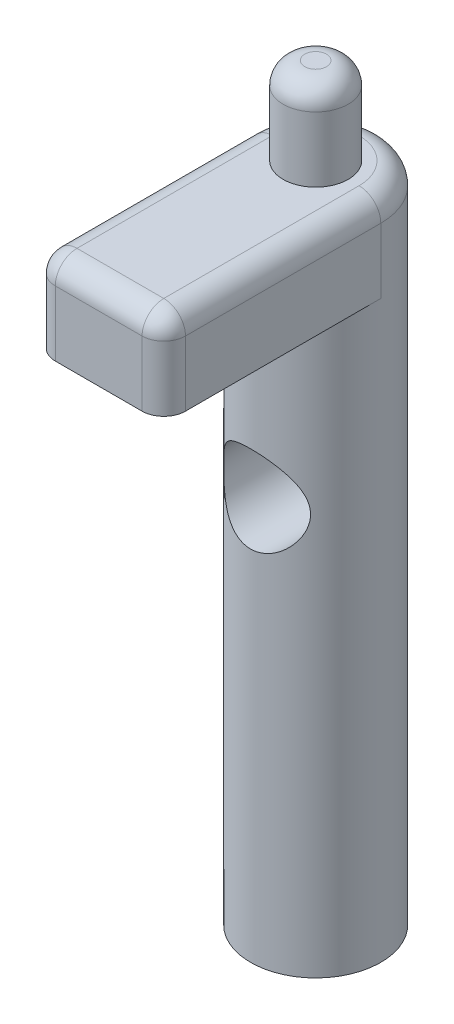
ISO-10303-21;
HEADER;
FILE_DESCRIPTION(('STEP AP214'),'2;1');
FILE_NAME('part.step','',(''),(''),'','','');
FILE_SCHEMA(('AUTOMOTIVE_DESIGN { 1 0 10303 214 1 1 1 1 }'));
ENDSEC;
DATA;
#1=APPLICATION_CONTEXT('core data for automotive mechanical design processes');
#2=APPLICATION_PROTOCOL_DEFINITION('international standard','automotive_design',2000,#1);
#3=PRODUCT_CONTEXT('',#1,'mechanical');
#4=PRODUCT('Part','Part','',(#3));
#5=PRODUCT_RELATED_PRODUCT_CATEGORY('part','',(#4));
#6=PRODUCT_DEFINITION_FORMATION('','',#4);
#7=PRODUCT_DEFINITION_CONTEXT('part definition',#1,'design');
#8=PRODUCT_DEFINITION('design','',#6,#7);
#9=PRODUCT_DEFINITION_SHAPE('','',#8);
#10=(LENGTH_UNIT() NAMED_UNIT(*) SI_UNIT(.MILLI.,.METRE.));
#11=(NAMED_UNIT(*) PLANE_ANGLE_UNIT() SI_UNIT($,.RADIAN.));
#12=(NAMED_UNIT(*) SI_UNIT($,.STERADIAN.) SOLID_ANGLE_UNIT());
#13=UNCERTAINTY_MEASURE_WITH_UNIT(LENGTH_MEASURE(1.E-05),#10,'distance_accuracy_value','');
#14=(GEOMETRIC_REPRESENTATION_CONTEXT(3) GLOBAL_UNCERTAINTY_ASSIGNED_CONTEXT((#13)) GLOBAL_UNIT_ASSIGNED_CONTEXT((#10,
#11,#12)) REPRESENTATION_CONTEXT('',''));
#15=CARTESIAN_POINT('',(0.,0.,0.));
#16=DIRECTION('',(0.,0.,1.));
#17=DIRECTION('',(1.,0.,0.));
#18=AXIS2_PLACEMENT_3D('',#15,#16,#17);
#19=CARTESIAN_POINT('',(0.,25.,0.));
#20=DIRECTION('',(0.,-1.,0.));
#21=DIRECTION('',(0.,0.,-1.));
#22=AXIS2_PLACEMENT_3D('',#19,#20,#21);
#23=CYLINDRICAL_SURFACE('',#22,3.);
#24=DIRECTION('',(0.,-1.,0.));
#25=VECTOR('',#24,1.);
#26=CARTESIAN_POINT('',(-3.,29.,0.));
#27=LINE('',#26,#25);
#28=CARTESIAN_POINT('',(-3.,28.,0.));
#29=VERTEX_POINT('',#28);
#30=CARTESIAN_POINT('',(-3.,25.,0.));
#31=VERTEX_POINT('',#30);
#32=EDGE_CURVE('E117',#29,#31,#27,.T.);
#33=ORIENTED_EDGE('',*,*,#32,.F.);
#34=CARTESIAN_POINT('',(0.,28.,0.));
#35=DIRECTION('',(0.,1.,0.));
#36=DIRECTION('',(0.,0.,1.));
#37=AXIS2_PLACEMENT_3D('',#34,#35,#36);
#38=CIRCLE('',#37,3.);
#39=CARTESIAN_POINT('',(3.,28.,0.));
#40=VERTEX_POINT('',#39);
#41=EDGE_CURVE('E115',#29,#40,#38,.F.);
#42=ORIENTED_EDGE('',*,*,#41,.T.);
#43=DIRECTION('',(0.,-1.,0.));
#44=VECTOR('',#43,1.);
#45=CARTESIAN_POINT('',(3.,29.,0.));
#46=LINE('',#45,#44);
#47=CARTESIAN_POINT('',(3.,25.,0.));
#48=VERTEX_POINT('',#47);
#49=EDGE_CURVE('E100',#40,#48,#46,.T.);
#50=ORIENTED_EDGE('',*,*,#49,.T.);
#51=CARTESIAN_POINT('',(0.,25.,0.));
#52=DIRECTION('',(0.,-1.,0.));
#53=DIRECTION('',(0.,0.,1.));
#54=AXIS2_PLACEMENT_3D('',#51,#52,#53);
#55=CIRCLE('',#54,3.);
#56=EDGE_CURVE('E106',#48,#31,#55,.T.);
#57=ORIENTED_EDGE('',*,*,#56,.T.);
#58=EDGE_LOOP('',(#33,#42,#50,#57));
#59=FACE_BOUND('',#58,.T.);
#60=CARTESIAN_POINT('',(-2.,17.,2.23606797749979));
#61=CARTESIAN_POINT('',(-1.99999453997731,16.9023716891314,2.23607753462817));
#62=CARTESIAN_POINT('',(-1.99278992503664,16.8047092462912,2.24258071047442));
#63=CARTESIAN_POINT('',(-1.96458268317731,16.6128800883492,2.26731972501617));
#64=CARTESIAN_POINT('',(-1.94355530587862,16.5187199644704,2.2855766081271));
#65=CARTESIAN_POINT('',(-1.88935861676632,16.3372645581223,2.3305658582557));
#66=CARTESIAN_POINT('',(-1.85630718014214,16.2499123032623,2.35721561794602));
#67=CARTESIAN_POINT('',(-1.77934008393538,16.0821341676533,2.41584094681826));
#68=CARTESIAN_POINT('',(-1.73542216812163,16.0017097300235,2.44781762158831));
#69=CARTESIAN_POINT('',(-1.63002410007714,15.8363531123831,2.51946072932026));
#70=CARTESIAN_POINT('',(-1.56687435451732,15.7526678822828,2.55954936090364));
#71=CARTESIAN_POINT('',(-1.4281921974068,15.5959972911257,2.63944827308083));
#72=CARTESIAN_POINT('',(-1.3526477317708,15.5230224783415,2.67925824297985));
#73=CARTESIAN_POINT('',(-1.17815690494295,15.3793563412183,2.76088818523747));
#74=CARTESIAN_POINT('',(-1.07740643965819,15.3105174882243,2.80216785846923));
#75=CARTESIAN_POINT('',(-0.862470964212231,15.1913579045099,2.87558484482764));
#76=CARTESIAN_POINT('',(-0.748301152321703,15.1410164859688,2.90773236231037));
#77=CARTESIAN_POINT('',(-0.523249073480002,15.0664435989825,2.95599907464725));
#78=CARTESIAN_POINT('',(-0.413434725181415,15.0399166555044,2.97351175615867));
#79=CARTESIAN_POINT('',(-0.189695448729861,15.0058155107164,2.99609745461921));
#80=CARTESIAN_POINT('',(-0.0757758812858245,14.9982174407746,3.00118613762359));
#81=CARTESIAN_POINT('',(0.13414705023233,15.0021724499491,2.99855361722953));
#82=CARTESIAN_POINT('',(0.230240638008753,15.0109890513171,2.99266264910127));
#83=CARTESIAN_POINT('',(0.419238633271016,15.0420910513589,2.9720818279002));
#84=CARTESIAN_POINT('',(0.512142807649724,15.0643774323035,2.95739133313102));
#85=CARTESIAN_POINT('',(0.692077937671169,15.1211956847946,2.92052091703736));
#86=CARTESIAN_POINT('',(0.779130623845962,15.1556788851986,2.89837077982679));
#87=CARTESIAN_POINT('',(0.946209150653556,15.2355536429528,2.84821104476287));
#88=CARTESIAN_POINT('',(1.0262337049694,15.2809471915015,2.82020037745161));
#89=CARTESIAN_POINT('',(1.18828429196344,15.3879787374599,2.75618058450702));
#90=CARTESIAN_POINT('',(1.26919148099708,15.4509675233528,2.71960408792025));
#91=CARTESIAN_POINT('',(1.41998807498305,15.5878986794803,2.64400601826998));
#92=CARTESIAN_POINT('',(1.48986013519457,15.6618579459338,2.60498072815232));
#93=CARTESIAN_POINT('',(1.62772235326165,15.8319632102133,2.52150044944152));
#94=CARTESIAN_POINT('',(1.69373593126354,15.9297710797145,2.47714320008932));
#95=CARTESIAN_POINT('',(1.80834874945483,16.1375098392207,2.39475610831095));
#96=CARTESIAN_POINT('',(1.85697718654898,16.2474199944139,2.35671571534889));
#97=CARTESIAN_POINT('',(1.92332724567776,16.4447190620731,2.30262870306889));
#98=CARTESIAN_POINT('',(1.94590791747533,16.5295933700569,2.28340364577668));
#99=CARTESIAN_POINT('',(1.97979555580014,16.7030394898168,2.25409039789612));
#100=CARTESIAN_POINT('',(1.99112206964395,16.7916046111726,2.24398636782354));
#101=CARTESIAN_POINT('',(2.00179400148877,16.9704429864415,2.23447556987372));
#102=CARTESIAN_POINT('',(2.00108729753098,17.0607219785201,2.2351153386647));
#103=CARTESIAN_POINT('',(1.98761629716365,17.239683833955,2.24709880368953));
#104=CARTESIAN_POINT('',(1.97484222690381,17.3283653441074,2.2584511764885));
#105=CARTESIAN_POINT('',(1.93899811187046,17.4973894175498,2.28927977500746));
#106=CARTESIAN_POINT('',(1.91646174529973,17.5779277090026,2.30833187069749));
#107=CARTESIAN_POINT('',(1.86223041628513,17.7341262360503,2.3522995853365));
#108=CARTESIAN_POINT('',(1.83053237805352,17.809784822963,2.3772171729463));
#109=CARTESIAN_POINT('',(1.75163346599563,17.9702020038475,2.43611483596194));
#110=CARTESIAN_POINT('',(1.70260028818246,18.0537568115427,2.47091081434316));
#111=CARTESIAN_POINT('',(1.59352731501439,18.2124168026173,2.54262514806633));
#112=CARTESIAN_POINT('',(1.53347411883828,18.2875115167425,2.57954604947543));
#113=CARTESIAN_POINT('',(1.38876657712435,18.4439623474675,2.66075678321007));
#114=CARTESIAN_POINT('',(1.30160386514207,18.5231028482483,2.70489452138573));
#115=CARTESIAN_POINT('',(1.1130994886622,18.6658166829403,2.78775581841638));
#116=CARTESIAN_POINT('',(1.01177047745701,18.7294037712567,2.82648414789457));
#117=CARTESIAN_POINT('',(0.817487474821804,18.8278917389176,2.88790821242222));
#118=CARTESIAN_POINT('',(0.726662364886327,18.8659565044404,2.91225458111008));
#119=CARTESIAN_POINT('',(0.538757079020521,18.9286071943204,2.95278707867041));
#120=CARTESIAN_POINT('',(0.441682263858775,18.9532045028598,2.96898009871993));
#121=CARTESIAN_POINT('',(0.243369392303449,18.9876969638388,2.99178364026746));
#122=CARTESIAN_POINT('',(0.142114836924324,18.9975266795067,2.99835150856532));
#123=CARTESIAN_POINT('',(-0.0608555465807265,19.0016478514171,3.00109821029056));
#124=CARTESIAN_POINT('',(-0.162571330953442,18.9959407519562,2.99727800938902));
#125=CARTESIAN_POINT('',(-0.355757532528102,18.9703405109953,2.98029555977324));
#126=CARTESIAN_POINT('',(-0.447435143070527,18.9515090151382,2.96783277209856));
#127=CARTESIAN_POINT('',(-0.626018422997059,18.9017619905691,2.93536106206933));
#128=CARTESIAN_POINT('',(-0.712923348686886,18.8708445846527,2.91535096747103));
#129=CARTESIAN_POINT('',(-0.885147296608346,18.796061295116,2.86791765486194));
#130=CARTESIAN_POINT('',(-0.97008358920026,18.7515496925049,2.84013248946338));
#131=CARTESIAN_POINT('',(-1.13155266268318,18.651849355374,2.77975408235472));
#132=CARTESIAN_POINT('',(-1.20808037205002,18.596654232048,2.74715796645263));
#133=CARTESIAN_POINT('',(-1.36329422201402,18.4673710976637,2.67392931472394));
#134=CARTESIAN_POINT('',(-1.44042679526091,18.391676976326,2.6328391387737));
#135=CARTESIAN_POINT('',(-1.58160022281595,18.2288864584542,2.55053357649487));
#136=CARTESIAN_POINT('',(-1.64563128323923,18.1417816111659,2.50931811970155));
#137=CARTESIAN_POINT('',(-1.75513253518411,17.9641324092447,2.43384213590298));
#138=CARTESIAN_POINT('',(-1.8016464689721,17.8743581900497,2.39929086741904));
#139=CARTESIAN_POINT('',(-1.88115802340272,17.6867155510068,2.33747501591023));
#140=CARTESIAN_POINT('',(-1.91418190281333,17.5888633061378,2.31019631295305));
#141=CARTESIAN_POINT('',(-1.95936262470908,17.4092285315755,2.2719105192954));
#142=CARTESIAN_POINT('',(-1.97452228373248,17.3286917632097,2.25863695410151));
#143=CARTESIAN_POINT('',(-1.99483915818926,17.1654435994955,2.24071519216009));
#144=CARTESIAN_POINT('',(-2.00000462703715,17.0827340557394,2.23605987841475));
#145=CARTESIAN_POINT('',(-2.,17.,2.23606797749979));
#146=B_SPLINE_CURVE_WITH_KNOTS('',3,(#60,#61,#62,#63,#64,#65,#66,#67,#68,#69,#70,#71,#72,#73,
#74,#75,#76,#77,#78,#79,#80,#81,#82,#83,#84,#85,#86,#87,#88,#89,#90,#91,#92,#93,#94,#95,#96,#97,
#98,#99,#100,#101,#102,#103,#104,#105,#106,#107,#108,#109,#110,#111,#112,#113,#114,#115,#116,
#117,#118,#119,#120,#121,#122,#123,#124,#125,#126,#127,#128,#129,#130,#131,#132,#133,#134,#135,
#136,#137,#138,#139,#140,#141,#142,#143,#144,#145),.UNSPECIFIED.,.T.,.F.,(4,2,2,2,2,2,2,2,2,2,2,
2,2,2,2,2,2,2,2,2,2,2,2,2,2,2,2,2,2,2,2,2,2,2,2,2,2,2,2,2,2,2,4),(0.,0.292506930722154,
0.585539042259288,0.875772651216276,1.16606657266549,1.50154677068638,1.83735518436276,
2.22167031006289,2.6055542938858,2.94637482063579,3.28676536688298,3.57539534955742,
3.86404638283746,4.15155831973191,4.43912276903,4.76447525946635,5.09033414796638,
5.46678703504944,5.84260469743948,6.11126090401324,6.37944966235486,6.64880037638036,
6.91836943570597,7.17476451706936,7.43124577644957,7.73899230052351,8.04711556801508,
8.42254684520962,8.7976449057258,9.10070580611698,9.40351012888472,9.70765229266164,
10.0117661844615,10.2937678224973,10.5758132789284,10.874178629859,11.1727229593109,
11.5182220628451,11.863978504186,12.1833412579672,12.5020793664923,12.7501661630426,
12.9980479966543),.UNSPECIFIED.);
#147=CARTESIAN_POINT('',(-2.,17.,2.23606797749979));
#148=VERTEX_POINT('',#147);
#149=EDGE_CURVE('E177',#148,#148,#146,.T.);
#150=ORIENTED_EDGE('',*,*,#149,.F.);
#151=EDGE_LOOP('',(#150));
#152=FACE_BOUND('',#151,.T.);
#153=CARTESIAN_POINT('',(0.,19.,-3.));
#154=CARTESIAN_POINT('',(0.100484716668078,19.0000005496325,-3.0000004164484));
#155=CARTESIAN_POINT('',(0.200969087132901,18.9923860300445,-2.99490802753388));
#156=CARTESIAN_POINT('',(0.398733058031681,18.9624031358943,-2.97504652423809));
#157=CARTESIAN_POINT('',(0.496011113955006,18.9400277568767,-2.96027281581235));
#158=CARTESIAN_POINT('',(0.684212307854249,18.8818922826752,-2.92250482404708));
#159=CARTESIAN_POINT('',(0.775162872657554,18.8461948599921,-2.89954905493315));
#160=CARTESIAN_POINT('',(0.94941529099726,18.7629366367285,-2.8472613787744));
#161=CARTESIAN_POINT('',(1.03271603160967,18.7153741136994,-2.8179285460551));
#162=CARTESIAN_POINT('',(1.19728470077011,18.6053430626326,-2.75227329369838));
#163=CARTESIAN_POINT('',(1.27778030546067,18.5419521392571,-2.71556897579319));
#164=CARTESIAN_POINT('',(1.42772804469274,18.4042699513416,-2.63982313083466));
#165=CARTESIAN_POINT('',(1.49716405543888,18.3299630701623,-2.60077830356832));
#166=CARTESIAN_POINT('',(1.63422297745496,18.1589476323873,-2.51728264678794));
#167=CARTESIAN_POINT('',(1.6998318636275,18.0605543467966,-2.47295067937795));
#168=CARTESIAN_POINT('',(1.81350357014175,17.8516366223535,-2.3908414735282));
#169=CARTESIAN_POINT('',(1.86159673426503,17.7411335984373,-2.35305295954668));
#170=CARTESIAN_POINT('',(1.92674035011438,17.5432887065784,-2.2997626664146));
#171=CARTESIAN_POINT('',(1.94874447236008,17.4584715471261,-2.28097627892403));
#172=CARTESIAN_POINT('',(1.98150617785229,17.2852554952584,-2.25257969659604));
#173=CARTESIAN_POINT('',(1.99228314651963,17.1968630512739,-2.24295368744147));
#174=CARTESIAN_POINT('',(2.00191364141228,17.0185252211435,-2.23436605608045));
#175=CARTESIAN_POINT('',(2.00071842917524,16.9285749765476,-2.23544802558502));
#176=CARTESIAN_POINT('',(1.98637581333356,16.7503650265002,-2.24819775483425));
#177=CARTESIAN_POINT('',(1.97321828380393,16.6621068179719,-2.25987448286881));
#178=CARTESIAN_POINT('',(1.93664994217326,16.4935329487581,-2.29127185989959));
#179=CARTESIAN_POINT('',(1.91371711479477,16.4130386640612,-2.31061488324375));
#180=CARTESIAN_POINT('',(1.85870118583424,16.2569763090242,-2.35509622933623));
#181=CARTESIAN_POINT('',(1.8266150732855,16.1814098697613,-2.3802364585489));
#182=CARTESIAN_POINT('',(1.74673818732648,16.0209746046436,-2.43964196377947));
#183=CARTESIAN_POINT('',(1.69708052300445,15.9373400995169,-2.47472317740626));
#184=CARTESIAN_POINT('',(1.58668960438221,15.7786166047142,-2.54691537733438));
#185=CARTESIAN_POINT('',(1.52594268999614,15.7035383422379,-2.58402882709328));
#186=CARTESIAN_POINT('',(1.37981165322308,15.5474574543966,-2.66543343763724));
#187=CARTESIAN_POINT('',(1.29193938283656,15.4686659513172,-2.7095474472056));
#188=CARTESIAN_POINT('',(1.10200799908008,15.3268035054615,-2.79218100665212));
#189=CARTESIAN_POINT('',(0.999962299343694,15.263717854591,-2.83070577648042));
#190=CARTESIAN_POINT('',(0.804857827096526,15.1665222813771,-2.89145404090364));
#191=CARTESIAN_POINT('',(0.713957643371906,15.1291566366611,-2.9153926116554));
#192=CARTESIAN_POINT('',(0.526036043935477,15.0678950743746,-2.95507719030499));
#193=CARTESIAN_POINT('',(0.429019879001646,15.0439877728678,-2.97083012127544));
#194=CARTESIAN_POINT('',(0.230985453172277,15.010838834762,-2.99275882156808));
#195=CARTESIAN_POINT('',(0.129951811934155,15.0016605390617,-2.99889322461187));
#196=CARTESIAN_POINT('',(-0.0724415193893494,14.9987529114378,-3.00083114965147));
#197=CARTESIAN_POINT('',(-0.173801186186628,15.0050224995112,-2.99663539385634));
#198=CARTESIAN_POINT('',(-0.366455717204242,15.031624055562,-2.97899589424273));
#199=CARTESIAN_POINT('',(-0.457957444679196,15.0509372977552,-2.96622246390226));
#200=CARTESIAN_POINT('',(-0.636116392427404,15.1015956860129,-2.93318449284837));
#201=CARTESIAN_POINT('',(-0.722772837571136,15.1329427509282,-2.91291875746989));
#202=CARTESIAN_POINT('',(-0.894664750465999,15.2086522970449,-2.86496352529157));
#203=CARTESIAN_POINT('',(-0.979496184631422,15.2536881540819,-2.83689870135785));
#204=CARTESIAN_POINT('',(-1.14068302395729,15.3544332899463,-2.7760185561151));
#205=CARTESIAN_POINT('',(-1.21703314820091,15.4101491605322,-2.74320030403941));
#206=CARTESIAN_POINT('',(-1.37185445482324,15.5406078681575,-2.6695454665343));
#207=CARTESIAN_POINT('',(-1.44875187569565,15.6169662600751,-2.62826156800165));
#208=CARTESIAN_POINT('',(-1.58933968069449,15.7811114299571,-2.54571173085957));
#209=CARTESIAN_POINT('',(-1.6530209365723,15.8689060391075,-2.50444582417845));
#210=CARTESIAN_POINT('',(-1.76124776549313,16.0471424127681,-2.4293967897058));
#211=CARTESIAN_POINT('',(-1.80695636125283,16.1367320334622,-2.39527597025701));
#212=CARTESIAN_POINT('',(-1.88496213740264,16.3238726524436,-2.33438974266154));
#213=CARTESIAN_POINT('',(-1.91728345682189,16.4214089383046,-2.30761112529822));
#214=CARTESIAN_POINT('',(-1.9623584346534,16.6045644871954,-2.26933208182633));
#215=CARTESIAN_POINT('',(-1.97758597566225,16.689171809876,-2.25594998021257));
#216=CARTESIAN_POINT('',(-1.99699205923373,16.8605732813184,-2.23879466438398));
#217=CARTESIAN_POINT('',(-2.00118260285317,16.9473649511395,-2.23501101347816));
#218=CARTESIAN_POINT('',(-1.99823921981266,17.1206430567237,-2.23764201149982));
#219=CARTESIAN_POINT('',(-1.99109858767783,17.2071292813738,-2.24406269907463));
#220=CARTESIAN_POINT('',(-1.96596997224746,17.3773435285321,-2.26610452403491));
#221=CARTESIAN_POINT('',(-1.94796751728257,17.4610677138243,-2.28173793527615));
#222=CARTESIAN_POINT('',(-1.89593035657494,17.6457111864812,-2.32526843904801));
#223=CARTESIAN_POINT('',(-1.85890187130765,17.7452677129433,-2.35532333574983));
#224=CARTESIAN_POINT('',(-1.7708452623622,17.9354868343842,-2.42222161121309));
#225=CARTESIAN_POINT('',(-1.71979748341259,18.0261366979917,-2.459074496867));
#226=CARTESIAN_POINT('',(-1.60398280555152,18.1992818871362,-2.53617186577119));
#227=CARTESIAN_POINT('',(-1.5389830989402,18.2815987454231,-2.5764658739228));
#228=CARTESIAN_POINT('',(-1.39671768031094,18.4353224782579,-2.65628301537844));
#229=CARTESIAN_POINT('',(-1.31944821025748,18.5067259970292,-2.69580590832396));
#230=CARTESIAN_POINT('',(-1.14145732976973,18.6467121043091,-2.77631551964083));
#231=CARTESIAN_POINT('',(-1.03896166955574,18.7134186401783,-2.81669805449991));
#232=CARTESIAN_POINT('',(-0.820868555771208,18.8279132766653,-2.88777665874161));
#233=CARTESIAN_POINT('',(-0.705292062449148,18.875731106824,-2.91848793445255));
#234=CARTESIAN_POINT('',(-0.491435069835738,18.9411545781638,-2.96101644836896));
#235=CARTESIAN_POINT('',(-0.395012325257915,18.9631110390986,-2.97551480368935));
#236=CARTESIAN_POINT('',(-0.199058012023943,18.9925280325381,-2.99500280141853));
#237=CARTESIAN_POINT('',(-0.0995288361880062,18.999999455596,-2.99999958751315));
#238=CARTESIAN_POINT('',(0.,19.,-3.));
#239=B_SPLINE_CURVE_WITH_KNOTS('',3,(#153,#154,#155,#156,#157,#158,#159,#160,#161,#162,#163,
#164,#165,#166,#167,#168,#169,#170,#171,#172,#173,#174,#175,#176,#177,#178,#179,#180,#181,#182,
#183,#184,#185,#186,#187,#188,#189,#190,#191,#192,#193,#194,#195,#196,#197,#198,#199,#200,#201,
#202,#203,#204,#205,#206,#207,#208,#209,#210,#211,#212,#213,#214,#215,#216,#217,#218,#219,#220,
#221,#222,#223,#224,#225,#226,#227,#228,#229,#230,#231,#232,#233,#234,#235,#236,#237,#238),
.UNSPECIFIED.,.T.,.F.,(4,2,2,2,2,2,2,2,2,2,2,2,2,2,2,2,2,2,2,2,2,2,2,2,2,2,2,2,2,2,2,2,2,2,2,2,
2,2,2,2,2,2,4),(0.,0.3010532265054,0.602249414348688,0.902046153190231,1.20188643867386,
1.52717029000557,1.85292411604319,2.23006683295982,2.60655305445439,2.87433693676029,
3.1416576784581,3.41006711735378,3.67870397263352,3.93548862198022,4.19235783805079,
4.50147574660874,4.81097703780057,5.18718954496753,5.56304840301363,5.86524087696759,
6.16717735142814,6.47040883294251,6.77361911533415,7.05553084792473,7.33748755138271,
7.63652346829517,7.93574454945204,8.28228176141292,8.62905753175759,8.94649935304477,
9.26336626640724,9.52324048016135,9.78283200333092,10.0425772028455,10.302669238524,
10.6320660870419,10.9619271337795,11.2977924520448,11.6337608397015,12.0179535155883,
12.4015390656083,12.6999529136674,12.9981423125957),.UNSPECIFIED.);
#240=CARTESIAN_POINT('',(0.,19.,-3.));
#241=VERTEX_POINT('',#240);
#242=EDGE_CURVE('E158',#241,#241,#239,.T.);
#243=ORIENTED_EDGE('',*,*,#242,.F.);
#244=EDGE_LOOP('',(#243));
#245=FACE_BOUND('',#244,.T.);
#246=CARTESIAN_POINT('',(0.,-1.5,0.));
#247=DIRECTION('',(0.,-1.,0.));
#248=DIRECTION('',(0.,0.,-1.));
#249=AXIS2_PLACEMENT_3D('',#246,#247,#248);
#250=CIRCLE('',#249,3.);
#251=CARTESIAN_POINT('',(0.,-1.5,-3.));
#252=VERTEX_POINT('',#251);
#253=EDGE_CURVE('E365',#252,#252,#250,.T.);
#254=ORIENTED_EDGE('',*,*,#253,.F.);
#255=EDGE_LOOP('',(#254));
#256=FACE_BOUND('',#255,.T.);
#257=ADVANCED_FACE('F33',(#59,#152,#245,#256),#23,.T.);
#258=CARTESIAN_POINT('',(0.,29.,0.));
#259=DIRECTION('',(0.,1.,0.));
#260=DIRECTION('',(0.,0.,1.));
#261=AXIS2_PLACEMENT_3D('',#258,#259,#260);
#262=PLANE('',#261);
#263=CARTESIAN_POINT('',(0.,29.,0.));
#264=DIRECTION('',(0.,1.,0.));
#265=DIRECTION('',(0.,0.,1.));
#266=AXIS2_PLACEMENT_3D('',#263,#264,#265);
#267=CIRCLE('',#266,1.5);
#268=CARTESIAN_POINT('',(0.,29.,1.5));
#269=VERTEX_POINT('',#268);
#270=EDGE_CURVE('E184',#269,#269,#267,.T.);
#271=ORIENTED_EDGE('',*,*,#270,.F.);
#272=EDGE_LOOP('',(#271));
#273=FACE_BOUND('',#272,.T.);
#274=DIRECTION('',(0.,0.,-1.));
#275=VECTOR('',#274,1.);
#276=CARTESIAN_POINT('',(2.,29.,0.));
#277=LINE('',#276,#275);
#278=CARTESIAN_POINT('',(2.,29.,9.));
#279=VERTEX_POINT('',#278);
#280=CARTESIAN_POINT('',(2.,29.,0.));
#281=VERTEX_POINT('',#280);
#282=EDGE_CURVE('E134',#279,#281,#277,.T.);
#283=ORIENTED_EDGE('',*,*,#282,.T.);
#284=CARTESIAN_POINT('',(0.,29.,0.));
#285=DIRECTION('',(0.,1.,0.));
#286=DIRECTION('',(0.,0.,1.));
#287=AXIS2_PLACEMENT_3D('',#284,#285,#286);
#288=CIRCLE('',#287,2.);
#289=CARTESIAN_POINT('',(-2.,29.,0.));
#290=VERTEX_POINT('',#289);
#291=EDGE_CURVE('E136',#281,#290,#288,.T.);
#292=ORIENTED_EDGE('',*,*,#291,.T.);
#293=DIRECTION('',(0.,0.,1.));
#294=VECTOR('',#293,1.);
#295=CARTESIAN_POINT('',(-2.,29.,10.));
#296=LINE('',#295,#294);
#297=CARTESIAN_POINT('',(-2.,29.,9.));
#298=VERTEX_POINT('',#297);
#299=EDGE_CURVE('E132',#290,#298,#296,.T.);
#300=ORIENTED_EDGE('',*,*,#299,.T.);
#301=DIRECTION('',(1.,0.,0.));
#302=VECTOR('',#301,1.);
#303=CARTESIAN_POINT('',(3.,29.,9.));
#304=LINE('',#303,#302);
#305=EDGE_CURVE('E116',#298,#279,#304,.T.);
#306=ORIENTED_EDGE('',*,*,#305,.T.);
#307=EDGE_LOOP('',(#283,#292,#300,#306));
#308=FACE_BOUND('',#307,.T.);
#309=ADVANCED_FACE('F211',(#273,#308),#262,.T.);
#310=CARTESIAN_POINT('',(3.,29.,0.));
#311=DIRECTION('',(-1.,0.,0.));
#312=DIRECTION('',(0.,0.,1.));
#313=AXIS2_PLACEMENT_3D('',#310,#311,#312);
#314=PLANE('',#313);
#315=ORIENTED_EDGE('',*,*,#49,.F.);
#316=DIRECTION('',(0.,0.,-1.));
#317=VECTOR('',#316,1.);
#318=CARTESIAN_POINT('',(3.,28.,10.));
#319=LINE('',#318,#317);
#320=CARTESIAN_POINT('',(3.,28.,9.));
#321=VERTEX_POINT('',#320);
#322=EDGE_CURVE('E141',#40,#321,#319,.F.);
#323=ORIENTED_EDGE('',*,*,#322,.T.);
#324=DIRECTION('',(0.,-1.,0.));
#325=VECTOR('',#324,1.);
#326=CARTESIAN_POINT('',(3.,29.,9.));
#327=LINE('',#326,#325);
#328=CARTESIAN_POINT('',(3.,25.,9.));
#329=VERTEX_POINT('',#328);
#330=EDGE_CURVE('E102',#321,#329,#327,.T.);
#331=ORIENTED_EDGE('',*,*,#330,.T.);
#332=DIRECTION('',(0.,0.,-1.));
#333=VECTOR('',#332,1.);
#334=CARTESIAN_POINT('',(3.,25.,0.));
#335=LINE('',#334,#333);
#336=EDGE_CURVE('E97',#329,#48,#335,.T.);
#337=ORIENTED_EDGE('',*,*,#336,.T.);
#338=EDGE_LOOP('',(#315,#323,#331,#337));
#339=FACE_BOUND('',#338,.T.);
#340=ADVANCED_FACE('F99',(#339),#314,.F.);
#341=CARTESIAN_POINT('',(-3.,29.,0.));
#342=DIRECTION('',(1.,0.,0.));
#343=DIRECTION('',(0.,0.,-1.));
#344=AXIS2_PLACEMENT_3D('',#341,#342,#343);
#345=PLANE('',#344);
#346=DIRECTION('',(0.,-1.,0.));
#347=VECTOR('',#346,1.);
#348=CARTESIAN_POINT('',(-3.,29.,9.));
#349=LINE('',#348,#347);
#350=CARTESIAN_POINT('',(-3.,25.,9.));
#351=VERTEX_POINT('',#350);
#352=CARTESIAN_POINT('',(-3.,28.,9.));
#353=VERTEX_POINT('',#352);
#354=EDGE_CURVE('E143',#351,#353,#349,.F.);
#355=ORIENTED_EDGE('',*,*,#354,.T.);
#356=DIRECTION('',(0.,0.,1.));
#357=VECTOR('',#356,1.);
#358=CARTESIAN_POINT('',(-3.,28.,0.));
#359=LINE('',#358,#357);
#360=EDGE_CURVE('E145',#353,#29,#359,.F.);
#361=ORIENTED_EDGE('',*,*,#360,.T.);
#362=ORIENTED_EDGE('',*,*,#32,.T.);
#363=DIRECTION('',(0.,0.,1.));
#364=VECTOR('',#363,1.);
#365=CARTESIAN_POINT('',(-3.,25.,0.));
#366=LINE('',#365,#364);
#367=EDGE_CURVE('E123',#31,#351,#366,.T.);
#368=ORIENTED_EDGE('',*,*,#367,.T.);
#369=EDGE_LOOP('',(#355,#361,#362,#368));
#370=FACE_BOUND('',#369,.T.);
#371=ADVANCED_FACE('F206',(#370),#345,.F.);
#372=CARTESIAN_POINT('',(-3.,29.,10.));
#373=DIRECTION('',(0.,0.,-1.));
#374=DIRECTION('',(-1.,0.,0.));
#375=AXIS2_PLACEMENT_3D('',#372,#373,#374);
#376=PLANE('',#375);
#377=DIRECTION('',(1.,0.,0.));
#378=VECTOR('',#377,1.);
#379=CARTESIAN_POINT('',(-3.,28.,10.));
#380=LINE('',#379,#378);
#381=CARTESIAN_POINT('',(2.,28.,10.));
#382=VERTEX_POINT('',#381);
#383=CARTESIAN_POINT('',(-2.,28.,10.));
#384=VERTEX_POINT('',#383);
#385=EDGE_CURVE('E48',#382,#384,#380,.F.);
#386=ORIENTED_EDGE('',*,*,#385,.T.);
#387=DIRECTION('',(0.,-1.,0.));
#388=VECTOR('',#387,1.);
#389=CARTESIAN_POINT('',(-2.,29.,10.));
#390=LINE('',#389,#388);
#391=CARTESIAN_POINT('',(-2.,25.,10.));
#392=VERTEX_POINT('',#391);
#393=EDGE_CURVE('E149',#384,#392,#390,.T.);
#394=ORIENTED_EDGE('',*,*,#393,.T.);
#395=DIRECTION('',(1.,0.,0.));
#396=VECTOR('',#395,1.);
#397=CARTESIAN_POINT('',(-3.,25.,10.));
#398=LINE('',#397,#396);
#399=CARTESIAN_POINT('',(2.,25.,10.));
#400=VERTEX_POINT('',#399);
#401=EDGE_CURVE('E125',#392,#400,#398,.T.);
#402=ORIENTED_EDGE('',*,*,#401,.T.);
#403=DIRECTION('',(0.,-1.,0.));
#404=VECTOR('',#403,1.);
#405=CARTESIAN_POINT('',(2.,29.,10.));
#406=LINE('',#405,#404);
#407=EDGE_CURVE('E53',#400,#382,#406,.F.);
#408=ORIENTED_EDGE('',*,*,#407,.T.);
#409=EDGE_LOOP('',(#386,#394,#402,#408));
#410=FACE_BOUND('',#409,.T.);
#411=ADVANCED_FACE('F203',(#410),#376,.F.);
#412=CARTESIAN_POINT('',(0.,25.,0.));
#413=DIRECTION('',(0.,1.,0.));
#414=DIRECTION('',(0.,0.,1.));
#415=AXIS2_PLACEMENT_3D('',#412,#413,#414);
#416=PLANE('',#415);
#417=ORIENTED_EDGE('',*,*,#401,.F.);
#418=CARTESIAN_POINT('',(-2.,25.,9.));
#419=DIRECTION('',(0.,1.,0.));
#420=DIRECTION('',(0.,0.,1.));
#421=AXIS2_PLACEMENT_3D('',#418,#419,#420);
#422=CIRCLE('',#421,1.);
#423=EDGE_CURVE('E153',#392,#351,#422,.F.);
#424=ORIENTED_EDGE('',*,*,#423,.T.);
#425=ORIENTED_EDGE('',*,*,#367,.F.);
#426=ORIENTED_EDGE('',*,*,#56,.F.);
#427=ORIENTED_EDGE('',*,*,#336,.F.);
#428=CARTESIAN_POINT('',(2.,25.,9.));
#429=DIRECTION('',(0.,1.,0.));
#430=DIRECTION('',(0.,0.,1.));
#431=AXIS2_PLACEMENT_3D('',#428,#429,#430);
#432=CIRCLE('',#431,1.);
#433=EDGE_CURVE('E151',#329,#400,#432,.F.);
#434=ORIENTED_EDGE('',*,*,#433,.T.);
#435=EDGE_LOOP('',(#417,#424,#425,#426,#427,#434));
#436=FACE_BOUND('',#435,.T.);
#437=ADVANCED_FACE('F121',(#436),#416,.F.);
#438=CARTESIAN_POINT('',(2.,29.,9.));
#439=DIRECTION('',(0.,-1.,0.));
#440=DIRECTION('',(0.,0.,-1.));
#441=AXIS2_PLACEMENT_3D('',#438,#439,#440);
#442=CYLINDRICAL_SURFACE('',#441,1.);
#443=ORIENTED_EDGE('',*,*,#433,.F.);
#444=ORIENTED_EDGE('',*,*,#330,.F.);
#445=CARTESIAN_POINT('',(2.,28.,9.));
#446=DIRECTION('',(0.,1.,0.));
#447=DIRECTION('',(0.,0.,1.));
#448=AXIS2_PLACEMENT_3D('',#445,#446,#447);
#449=CIRCLE('',#448,1.);
#450=EDGE_CURVE('E107',#382,#321,#449,.T.);
#451=ORIENTED_EDGE('',*,*,#450,.F.);
#452=ORIENTED_EDGE('',*,*,#407,.F.);
#453=EDGE_LOOP('',(#443,#444,#451,#452));
#454=FACE_BOUND('',#453,.T.);
#455=ADVANCED_FACE('F202',(#454),#442,.T.);
#456=CARTESIAN_POINT('',(0.,28.,9.));
#457=DIRECTION('',(-1.,0.,0.));
#458=DIRECTION('',(0.,0.,1.));
#459=AXIS2_PLACEMENT_3D('',#456,#457,#458);
#460=CYLINDRICAL_SURFACE('',#459,1.);
#461=CARTESIAN_POINT('',(-2.,28.,9.));
#462=DIRECTION('',(-1.,0.,0.));
#463=DIRECTION('',(0.,-1.,0.));
#464=AXIS2_PLACEMENT_3D('',#461,#462,#463);
#465=CIRCLE('',#464,1.);
#466=EDGE_CURVE('E169',#384,#298,#465,.T.);
#467=ORIENTED_EDGE('',*,*,#466,.F.);
#468=ORIENTED_EDGE('',*,*,#385,.F.);
#469=CARTESIAN_POINT('',(2.,28.,9.));
#470=DIRECTION('',(1.,0.,0.));
#471=DIRECTION('',(0.,0.,-1.));
#472=AXIS2_PLACEMENT_3D('',#469,#470,#471);
#473=CIRCLE('',#472,1.);
#474=EDGE_CURVE('E172',#279,#382,#473,.T.);
#475=ORIENTED_EDGE('',*,*,#474,.F.);
#476=ORIENTED_EDGE('',*,*,#305,.F.);
#477=EDGE_LOOP('',(#467,#468,#475,#476));
#478=FACE_BOUND('',#477,.T.);
#479=ADVANCED_FACE('F239',(#478),#460,.T.);
#480=CARTESIAN_POINT('',(-2.,29.,9.));
#481=DIRECTION('',(0.,-1.,0.));
#482=DIRECTION('',(0.,0.,-1.));
#483=AXIS2_PLACEMENT_3D('',#480,#481,#482);
#484=CYLINDRICAL_SURFACE('',#483,1.);
#485=ORIENTED_EDGE('',*,*,#423,.F.);
#486=ORIENTED_EDGE('',*,*,#393,.F.);
#487=CARTESIAN_POINT('',(-2.,28.,9.));
#488=DIRECTION('',(0.,1.,0.));
#489=DIRECTION('',(0.,0.,1.));
#490=AXIS2_PLACEMENT_3D('',#487,#488,#489);
#491=CIRCLE('',#490,1.);
#492=EDGE_CURVE('E166',#353,#384,#491,.T.);
#493=ORIENTED_EDGE('',*,*,#492,.F.);
#494=ORIENTED_EDGE('',*,*,#354,.F.);
#495=EDGE_LOOP('',(#485,#486,#493,#494));
#496=FACE_BOUND('',#495,.T.);
#497=ADVANCED_FACE('F247',(#496),#484,.T.);
#498=CARTESIAN_POINT('',(2.,28.,9.));
#499=DIRECTION('',(0.,0.,1.));
#500=DIRECTION('',(1.,0.,0.));
#501=AXIS2_PLACEMENT_3D('',#498,#499,#500);
#502=SPHERICAL_SURFACE('',#501,1.);
#503=ORIENTED_EDGE('',*,*,#474,.T.);
#504=ORIENTED_EDGE('',*,*,#450,.T.);
#505=CARTESIAN_POINT('',(2.,28.,9.));
#506=DIRECTION('',(0.,0.,1.));
#507=DIRECTION('',(1.,0.,0.));
#508=AXIS2_PLACEMENT_3D('',#505,#506,#507);
#509=CIRCLE('',#508,1.);
#510=EDGE_CURVE('E163',#279,#321,#509,.F.);
#511=ORIENTED_EDGE('',*,*,#510,.F.);
#512=EDGE_LOOP('',(#503,#504,#511));
#513=FACE_BOUND('',#512,.T.);
#514=ADVANCED_FACE('F251',(#513),#502,.T.);
#515=CARTESIAN_POINT('',(-2.,28.,9.));
#516=DIRECTION('',(0.,0.,1.));
#517=DIRECTION('',(1.,0.,0.));
#518=AXIS2_PLACEMENT_3D('',#515,#516,#517);
#519=SPHERICAL_SURFACE('',#518,1.);
#520=ORIENTED_EDGE('',*,*,#492,.T.);
#521=ORIENTED_EDGE('',*,*,#466,.T.);
#522=CARTESIAN_POINT('',(-2.,28.,9.));
#523=DIRECTION('',(0.,0.,1.));
#524=DIRECTION('',(1.,0.,0.));
#525=AXIS2_PLACEMENT_3D('',#522,#523,#524);
#526=CIRCLE('',#525,1.);
#527=EDGE_CURVE('E160',#353,#298,#526,.F.);
#528=ORIENTED_EDGE('',*,*,#527,.F.);
#529=EDGE_LOOP('',(#520,#521,#528));
#530=FACE_BOUND('',#529,.T.);
#531=ADVANCED_FACE('F242',(#530),#519,.T.);
#532=CARTESIAN_POINT('',(2.,28.,0.));
#533=DIRECTION('',(0.,0.,1.));
#534=DIRECTION('',(1.,0.,0.));
#535=AXIS2_PLACEMENT_3D('',#532,#533,#534);
#536=CYLINDRICAL_SURFACE('',#535,1.);
#537=ORIENTED_EDGE('',*,*,#510,.T.);
#538=ORIENTED_EDGE('',*,*,#322,.F.);
#539=CARTESIAN_POINT('',(2.,28.,0.));
#540=DIRECTION('',(0.,0.,-1.));
#541=DIRECTION('',(-1.,0.,0.));
#542=AXIS2_PLACEMENT_3D('',#539,#540,#541);
#543=CIRCLE('',#542,1.);
#544=EDGE_CURVE('E157',#281,#40,#543,.T.);
#545=ORIENTED_EDGE('',*,*,#544,.F.);
#546=ORIENTED_EDGE('',*,*,#282,.F.);
#547=EDGE_LOOP('',(#537,#538,#545,#546));
#548=FACE_BOUND('',#547,.T.);
#549=ADVANCED_FACE('F229',(#548),#536,.T.);
#550=CARTESIAN_POINT('',(-2.,28.,0.));
#551=DIRECTION('',(0.,0.,-1.));
#552=DIRECTION('',(-1.,0.,0.));
#553=AXIS2_PLACEMENT_3D('',#550,#551,#552);
#554=CYLINDRICAL_SURFACE('',#553,1.);
#555=ORIENTED_EDGE('',*,*,#527,.T.);
#556=ORIENTED_EDGE('',*,*,#299,.F.);
#557=CARTESIAN_POINT('',(-2.,28.,0.));
#558=DIRECTION('',(0.,0.,-1.));
#559=DIRECTION('',(-1.,0.,0.));
#560=AXIS2_PLACEMENT_3D('',#557,#558,#559);
#561=CIRCLE('',#560,1.);
#562=EDGE_CURVE('E155',#29,#290,#561,.T.);
#563=ORIENTED_EDGE('',*,*,#562,.F.);
#564=ORIENTED_EDGE('',*,*,#360,.F.);
#565=EDGE_LOOP('',(#555,#556,#563,#564));
#566=FACE_BOUND('',#565,.T.);
#567=ADVANCED_FACE('F235',(#566),#554,.T.);
#568=CARTESIAN_POINT('',(0.,28.,0.));
#569=DIRECTION('',(0.,1.,0.));
#570=DIRECTION('',(0.,0.,1.));
#571=AXIS2_PLACEMENT_3D('',#568,#569,#570);
#572=TOROIDAL_SURFACE('',#571,2.,1.);
#573=ORIENTED_EDGE('',*,*,#544,.T.);
#574=ORIENTED_EDGE('',*,*,#41,.F.);
#575=ORIENTED_EDGE('',*,*,#562,.T.);
#576=ORIENTED_EDGE('',*,*,#291,.F.);
#577=EDGE_LOOP('',(#573,#574,#575,#576));
#578=FACE_BOUND('',#577,.T.);
#579=ADVANCED_FACE('F196',(#578),#572,.T.);
#580=CARTESIAN_POINT('',(0.,17.,4.));
#581=DIRECTION('',(0.,0.,-1.));
#582=DIRECTION('',(-1.,0.,0.));
#583=AXIS2_PLACEMENT_3D('',#580,#581,#582);
#584=CYLINDRICAL_SURFACE('',#583,2.);
#585=ORIENTED_EDGE('',*,*,#149,.T.);
#586=EDGE_LOOP('',(#585));
#587=FACE_BOUND('',#586,.T.);
#588=ORIENTED_EDGE('',*,*,#242,.T.);
#589=EDGE_LOOP('',(#588));
#590=FACE_BOUND('',#589,.T.);
#591=ADVANCED_FACE('F190',(#587,#590),#584,.F.);
#592=CARTESIAN_POINT('',(0.,33.,0.));
#593=DIRECTION('',(0.,-1.,0.));
#594=DIRECTION('',(0.,0.,-1.));
#595=AXIS2_PLACEMENT_3D('',#592,#593,#594);
#596=CYLINDRICAL_SURFACE('',#595,1.5);
#597=CARTESIAN_POINT('',(0.,32.,0.));
#598=DIRECTION('',(0.,1.,0.));
#599=DIRECTION('',(0.,0.,1.));
#600=AXIS2_PLACEMENT_3D('',#597,#598,#599);
#601=CIRCLE('',#600,1.5);
#602=CARTESIAN_POINT('',(0.,32.,1.5));
#603=VERTEX_POINT('',#602);
#604=EDGE_CURVE('E11',#603,#603,#601,.F.);
#605=ORIENTED_EDGE('',*,*,#604,.T.);
#606=EDGE_LOOP('',(#605));
#607=FACE_BOUND('',#606,.T.);
#608=ORIENTED_EDGE('',*,*,#270,.T.);
#609=EDGE_LOOP('',(#608));
#610=FACE_BOUND('',#609,.T.);
#611=ADVANCED_FACE('F195',(#607,#610),#596,.T.);
#612=CARTESIAN_POINT('',(0.,33.,0.));
#613=DIRECTION('',(0.,1.,0.));
#614=DIRECTION('',(0.,0.,1.));
#615=AXIS2_PLACEMENT_3D('',#612,#613,#614);
#616=PLANE('',#615);
#617=CARTESIAN_POINT('',(0.,33.,0.));
#618=DIRECTION('',(0.,1.,0.));
#619=DIRECTION('',(0.,0.,1.));
#620=AXIS2_PLACEMENT_3D('',#617,#618,#619);
#621=CIRCLE('',#620,0.5);
#622=CARTESIAN_POINT('',(0.,33.,0.5));
#623=VERTEX_POINT('',#622);
#624=EDGE_CURVE('E41',#623,#623,#621,.T.);
#625=ORIENTED_EDGE('',*,*,#624,.T.);
#626=EDGE_LOOP('',(#625));
#627=FACE_BOUND('',#626,.T.);
#628=ADVANCED_FACE('F323',(#627),#616,.T.);
#629=CARTESIAN_POINT('',(0.,32.,0.));
#630=DIRECTION('',(0.,1.,0.));
#631=DIRECTION('',(0.,0.,1.));
#632=AXIS2_PLACEMENT_3D('',#629,#630,#631);
#633=DEGENERATE_TOROIDAL_SURFACE('',#632,0.5,1.,.T.);
#634=ORIENTED_EDGE('',*,*,#604,.F.);
#635=EDGE_LOOP('',(#634));
#636=FACE_BOUND('',#635,.T.);
#637=ORIENTED_EDGE('',*,*,#624,.F.);
#638=EDGE_LOOP('',(#637));
#639=FACE_BOUND('',#638,.T.);
#640=ADVANCED_FACE('F35',(#636,#639),#633,.T.);
#641=CARTESIAN_POINT('',(0.,-1.5,0.));
#642=DIRECTION('',(0.,-1.,0.));
#643=DIRECTION('',(0.,0.,-1.));
#644=AXIS2_PLACEMENT_3D('',#641,#642,#643);
#645=PLANE('',#644);
#646=ORIENTED_EDGE('',*,*,#253,.T.);
#647=EDGE_LOOP('',(#646));
#648=FACE_BOUND('',#647,.T.);
#649=ADVANCED_FACE('F334',(#648),#645,.T.);
#650=CLOSED_SHELL('',(#257,#309,#340,#371,#411,#437,#455,#479,#497,#514,#531,#549,#567,#579,
#591,#611,#628,#640,#649));
#651=MANIFOLD_SOLID_BREP('B2',#650);
#652=ADVANCED_BREP_SHAPE_REPRESENTATION('',(#18,#651),#14);
#653=SHAPE_DEFINITION_REPRESENTATION(#9,#652);
ENDSEC;
END-ISO-10303-21;
